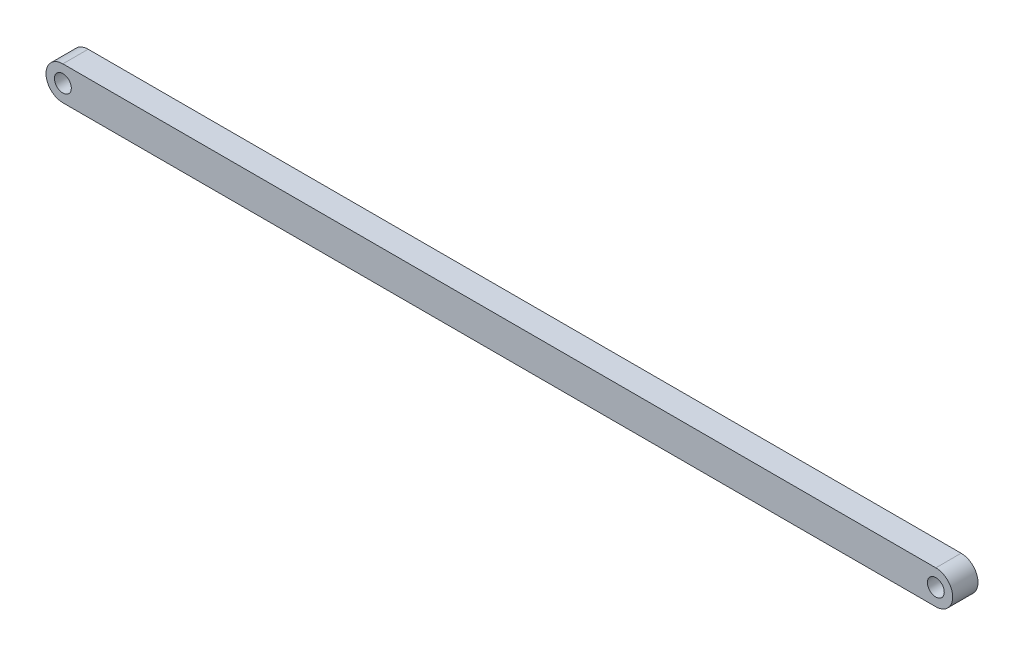
ISO-10303-21;
HEADER;
FILE_DESCRIPTION(('STEP AP214'),'2;1');
FILE_NAME('part.step','',(''),(''),'','','');
FILE_SCHEMA(('AUTOMOTIVE_DESIGN { 1 0 10303 214 1 1 1 1 }'));
ENDSEC;
DATA;
#1=APPLICATION_CONTEXT('core data for automotive mechanical design processes');
#2=APPLICATION_PROTOCOL_DEFINITION('international standard','automotive_design',2000,#1);
#3=PRODUCT_CONTEXT('',#1,'mechanical');
#4=PRODUCT('Part','Part','',(#3));
#5=PRODUCT_RELATED_PRODUCT_CATEGORY('part','',(#4));
#6=PRODUCT_DEFINITION_FORMATION('','',#4);
#7=PRODUCT_DEFINITION_CONTEXT('part definition',#1,'design');
#8=PRODUCT_DEFINITION('design','',#6,#7);
#9=PRODUCT_DEFINITION_SHAPE('','',#8);
#10=(LENGTH_UNIT() NAMED_UNIT(*) SI_UNIT(.MILLI.,.METRE.));
#11=(NAMED_UNIT(*) PLANE_ANGLE_UNIT() SI_UNIT($,.RADIAN.));
#12=(NAMED_UNIT(*) SI_UNIT($,.STERADIAN.) SOLID_ANGLE_UNIT());
#13=UNCERTAINTY_MEASURE_WITH_UNIT(LENGTH_MEASURE(1.E-05),#10,'distance_accuracy_value','');
#14=(GEOMETRIC_REPRESENTATION_CONTEXT(3) GLOBAL_UNCERTAINTY_ASSIGNED_CONTEXT((#13)) GLOBAL_UNIT_ASSIGNED_CONTEXT((#10,
#11,#12)) REPRESENTATION_CONTEXT('',''));
#15=CARTESIAN_POINT('',(0.,0.,0.));
#16=DIRECTION('',(0.,0.,1.));
#17=DIRECTION('',(1.,0.,0.));
#18=AXIS2_PLACEMENT_3D('',#15,#16,#17);
#19=CARTESIAN_POINT('',(0.,0.,3.));
#20=DIRECTION('',(0.,0.,1.));
#21=DIRECTION('',(1.,0.,0.));
#22=AXIS2_PLACEMENT_3D('',#19,#20,#21);
#23=PLANE('',#22);
#24=CARTESIAN_POINT('',(0.,0.,3.));
#25=DIRECTION('',(0.,0.,1.));
#26=DIRECTION('',(1.,0.,0.));
#27=AXIS2_PLACEMENT_3D('',#24,#25,#26);
#28=CIRCLE('',#27,1.);
#29=CARTESIAN_POINT('',(1.,0.,3.));
#30=VERTEX_POINT('',#29);
#31=EDGE_CURVE('E104',#30,#30,#28,.T.);
#32=ORIENTED_EDGE('',*,*,#31,.F.);
#33=EDGE_LOOP('',(#32));
#34=FACE_BOUND('',#33,.T.);
#35=CARTESIAN_POINT('',(0.,0.,3.));
#36=DIRECTION('',(0.,0.,1.));
#37=DIRECTION('',(1.,0.,0.));
#38=AXIS2_PLACEMENT_3D('',#35,#36,#37);
#39=CIRCLE('',#38,2.);
#40=CARTESIAN_POINT('',(0.,2.,3.));
#41=VERTEX_POINT('',#40);
#42=CARTESIAN_POINT('',(0.,-2.,3.));
#43=VERTEX_POINT('',#42);
#44=EDGE_CURVE('E89',#41,#43,#39,.T.);
#45=ORIENTED_EDGE('',*,*,#44,.T.);
#46=DIRECTION('',(1.,0.,0.));
#47=VECTOR('',#46,1.);
#48=CARTESIAN_POINT('',(0.,-2.,3.));
#49=LINE('',#48,#47);
#50=CARTESIAN_POINT('',(103.5,-2.,3.));
#51=VERTEX_POINT('',#50);
#52=EDGE_CURVE('E84',#43,#51,#49,.T.);
#53=ORIENTED_EDGE('',*,*,#52,.T.);
#54=CARTESIAN_POINT('',(103.5,0.,3.));
#55=DIRECTION('',(0.,0.,1.));
#56=DIRECTION('',(1.,0.,0.));
#57=AXIS2_PLACEMENT_3D('',#54,#55,#56);
#58=CIRCLE('',#57,2.);
#59=CARTESIAN_POINT('',(103.5,2.,3.));
#60=VERTEX_POINT('',#59);
#61=EDGE_CURVE('E87',#51,#60,#58,.T.);
#62=ORIENTED_EDGE('',*,*,#61,.T.);
#63=DIRECTION('',(-1.,0.,0.));
#64=VECTOR('',#63,1.);
#65=CARTESIAN_POINT('',(0.,2.,3.));
#66=LINE('',#65,#64);
#67=EDGE_CURVE('E54',#60,#41,#66,.T.);
#68=ORIENTED_EDGE('',*,*,#67,.T.);
#69=EDGE_LOOP('',(#45,#53,#62,#68));
#70=FACE_BOUND('',#69,.T.);
#71=CARTESIAN_POINT('',(103.5,0.,3.));
#72=DIRECTION('',(0.,0.,1.));
#73=DIRECTION('',(1.,0.,0.));
#74=AXIS2_PLACEMENT_3D('',#71,#72,#73);
#75=CIRCLE('',#74,0.999999999999998);
#76=CARTESIAN_POINT('',(104.5,0.,3.));
#77=VERTEX_POINT('',#76);
#78=EDGE_CURVE('E119',#77,#77,#75,.T.);
#79=ORIENTED_EDGE('',*,*,#78,.F.);
#80=EDGE_LOOP('',(#79));
#81=FACE_BOUND('',#80,.T.);
#82=ADVANCED_FACE('F37',(#34,#70,#81),#23,.T.);
#83=CARTESIAN_POINT('',(0.,0.,0.));
#84=DIRECTION('',(0.,0.,1.));
#85=DIRECTION('',(1.,0.,0.));
#86=AXIS2_PLACEMENT_3D('',#83,#84,#85);
#87=PLANE('',#86);
#88=CARTESIAN_POINT('',(0.,0.,0.));
#89=DIRECTION('',(0.,0.,1.));
#90=DIRECTION('',(1.,0.,0.));
#91=AXIS2_PLACEMENT_3D('',#88,#89,#90);
#92=CIRCLE('',#91,2.);
#93=CARTESIAN_POINT('',(0.,2.,0.));
#94=VERTEX_POINT('',#93);
#95=CARTESIAN_POINT('',(0.,-2.,0.));
#96=VERTEX_POINT('',#95);
#97=EDGE_CURVE('E101',#94,#96,#92,.T.);
#98=ORIENTED_EDGE('',*,*,#97,.F.);
#99=DIRECTION('',(-1.,0.,0.));
#100=VECTOR('',#99,1.);
#101=CARTESIAN_POINT('',(0.,2.,0.));
#102=LINE('',#101,#100);
#103=CARTESIAN_POINT('',(103.5,2.,0.));
#104=VERTEX_POINT('',#103);
#105=EDGE_CURVE('E77',#104,#94,#102,.T.);
#106=ORIENTED_EDGE('',*,*,#105,.F.);
#107=CARTESIAN_POINT('',(103.5,0.,0.));
#108=DIRECTION('',(0.,0.,1.));
#109=DIRECTION('',(1.,0.,0.));
#110=AXIS2_PLACEMENT_3D('',#107,#108,#109);
#111=CIRCLE('',#110,2.);
#112=CARTESIAN_POINT('',(103.5,-2.,0.));
#113=VERTEX_POINT('',#112);
#114=EDGE_CURVE('E71',#113,#104,#111,.T.);
#115=ORIENTED_EDGE('',*,*,#114,.F.);
#116=DIRECTION('',(1.,0.,0.));
#117=VECTOR('',#116,1.);
#118=CARTESIAN_POINT('',(0.,-2.,0.));
#119=LINE('',#118,#117);
#120=EDGE_CURVE('E93',#96,#113,#119,.T.);
#121=ORIENTED_EDGE('',*,*,#120,.F.);
#122=EDGE_LOOP('',(#98,#106,#115,#121));
#123=FACE_BOUND('',#122,.T.);
#124=CARTESIAN_POINT('',(0.,0.,0.));
#125=DIRECTION('',(0.,0.,1.));
#126=DIRECTION('',(1.,0.,0.));
#127=AXIS2_PLACEMENT_3D('',#124,#125,#126);
#128=CIRCLE('',#127,1.);
#129=CARTESIAN_POINT('',(1.,0.,0.));
#130=VERTEX_POINT('',#129);
#131=EDGE_CURVE('E116',#130,#130,#128,.T.);
#132=ORIENTED_EDGE('',*,*,#131,.T.);
#133=EDGE_LOOP('',(#132));
#134=FACE_BOUND('',#133,.T.);
#135=CARTESIAN_POINT('',(103.5,0.,0.));
#136=DIRECTION('',(0.,0.,1.));
#137=DIRECTION('',(1.,0.,0.));
#138=AXIS2_PLACEMENT_3D('',#135,#136,#137);
#139=CIRCLE('',#138,0.999999999999998);
#140=CARTESIAN_POINT('',(104.5,0.,0.));
#141=VERTEX_POINT('',#140);
#142=EDGE_CURVE('E122',#141,#141,#139,.T.);
#143=ORIENTED_EDGE('',*,*,#142,.T.);
#144=EDGE_LOOP('',(#143));
#145=FACE_BOUND('',#144,.T.);
#146=ADVANCED_FACE('F112',(#123,#134,#145),#87,.F.);
#147=CARTESIAN_POINT('',(0.,0.,3.));
#148=DIRECTION('',(0.,0.,-1.));
#149=DIRECTION('',(-1.,0.,0.));
#150=AXIS2_PLACEMENT_3D('',#147,#148,#149);
#151=CYLINDRICAL_SURFACE('',#150,2.);
#152=ORIENTED_EDGE('',*,*,#97,.T.);
#153=DIRECTION('',(0.,0.,-1.));
#154=VECTOR('',#153,1.);
#155=CARTESIAN_POINT('',(0.,-2.,3.));
#156=LINE('',#155,#154);
#157=EDGE_CURVE('E11',#43,#96,#156,.T.);
#158=ORIENTED_EDGE('',*,*,#157,.F.);
#159=ORIENTED_EDGE('',*,*,#44,.F.);
#160=DIRECTION('',(0.,0.,-1.));
#161=VECTOR('',#160,1.);
#162=CARTESIAN_POINT('',(0.,2.,3.));
#163=LINE('',#162,#161);
#164=EDGE_CURVE('E97',#41,#94,#163,.T.);
#165=ORIENTED_EDGE('',*,*,#164,.T.);
#166=EDGE_LOOP('',(#152,#158,#159,#165));
#167=FACE_BOUND('',#166,.T.);
#168=ADVANCED_FACE('F39',(#167),#151,.T.);
#169=CARTESIAN_POINT('',(0.,-2.,3.));
#170=DIRECTION('',(0.,1.,0.));
#171=DIRECTION('',(0.,0.,1.));
#172=AXIS2_PLACEMENT_3D('',#169,#170,#171);
#173=PLANE('',#172);
#174=ORIENTED_EDGE('',*,*,#120,.T.);
#175=DIRECTION('',(0.,0.,-1.));
#176=VECTOR('',#175,1.);
#177=CARTESIAN_POINT('',(103.5,-2.,3.));
#178=LINE('',#177,#176);
#179=EDGE_CURVE('E46',#51,#113,#178,.T.);
#180=ORIENTED_EDGE('',*,*,#179,.F.);
#181=ORIENTED_EDGE('',*,*,#52,.F.);
#182=ORIENTED_EDGE('',*,*,#157,.T.);
#183=EDGE_LOOP('',(#174,#180,#181,#182));
#184=FACE_BOUND('',#183,.T.);
#185=ADVANCED_FACE('F92',(#184),#173,.F.);
#186=CARTESIAN_POINT('',(103.5,0.,3.));
#187=DIRECTION('',(0.,0.,-1.));
#188=DIRECTION('',(-1.,0.,0.));
#189=AXIS2_PLACEMENT_3D('',#186,#187,#188);
#190=CYLINDRICAL_SURFACE('',#189,2.);
#191=ORIENTED_EDGE('',*,*,#114,.T.);
#192=DIRECTION('',(0.,0.,-1.));
#193=VECTOR('',#192,1.);
#194=CARTESIAN_POINT('',(103.5,2.,3.));
#195=LINE('',#194,#193);
#196=EDGE_CURVE('E94',#60,#104,#195,.T.);
#197=ORIENTED_EDGE('',*,*,#196,.F.);
#198=ORIENTED_EDGE('',*,*,#61,.F.);
#199=ORIENTED_EDGE('',*,*,#179,.T.);
#200=EDGE_LOOP('',(#191,#197,#198,#199));
#201=FACE_BOUND('',#200,.T.);
#202=ADVANCED_FACE('F95',(#201),#190,.T.);
#203=CARTESIAN_POINT('',(0.,2.,3.));
#204=DIRECTION('',(0.,-1.,0.));
#205=DIRECTION('',(0.,0.,-1.));
#206=AXIS2_PLACEMENT_3D('',#203,#204,#205);
#207=PLANE('',#206);
#208=ORIENTED_EDGE('',*,*,#105,.T.);
#209=ORIENTED_EDGE('',*,*,#164,.F.);
#210=ORIENTED_EDGE('',*,*,#67,.F.);
#211=ORIENTED_EDGE('',*,*,#196,.T.);
#212=EDGE_LOOP('',(#208,#209,#210,#211));
#213=FACE_BOUND('',#212,.T.);
#214=ADVANCED_FACE('F109',(#213),#207,.F.);
#215=CARTESIAN_POINT('',(0.,0.,3.));
#216=DIRECTION('',(0.,0.,-1.));
#217=DIRECTION('',(-1.,0.,0.));
#218=AXIS2_PLACEMENT_3D('',#215,#216,#217);
#219=CYLINDRICAL_SURFACE('',#218,1.);
#220=ORIENTED_EDGE('',*,*,#31,.T.);
#221=EDGE_LOOP('',(#220));
#222=FACE_BOUND('',#221,.T.);
#223=ORIENTED_EDGE('',*,*,#131,.F.);
#224=EDGE_LOOP('',(#223));
#225=FACE_BOUND('',#224,.T.);
#226=ADVANCED_FACE('F139',(#222,#225),#219,.F.);
#227=CARTESIAN_POINT('',(103.5,0.,3.));
#228=DIRECTION('',(0.,0.,-1.));
#229=DIRECTION('',(-1.,0.,0.));
#230=AXIS2_PLACEMENT_3D('',#227,#228,#229);
#231=CYLINDRICAL_SURFACE('',#230,0.999999999999998);
#232=ORIENTED_EDGE('',*,*,#78,.T.);
#233=EDGE_LOOP('',(#232));
#234=FACE_BOUND('',#233,.T.);
#235=ORIENTED_EDGE('',*,*,#142,.F.);
#236=EDGE_LOOP('',(#235));
#237=FACE_BOUND('',#236,.T.);
#238=ADVANCED_FACE('F128',(#234,#237),#231,.F.);
#239=CLOSED_SHELL('',(#82,#146,#168,#185,#202,#214,#226,#238));
#240=MANIFOLD_SOLID_BREP('B2',#239);
#241=ADVANCED_BREP_SHAPE_REPRESENTATION('',(#18,#240),#14);
#242=SHAPE_DEFINITION_REPRESENTATION(#9,#241);
ENDSEC;
END-ISO-10303-21;
